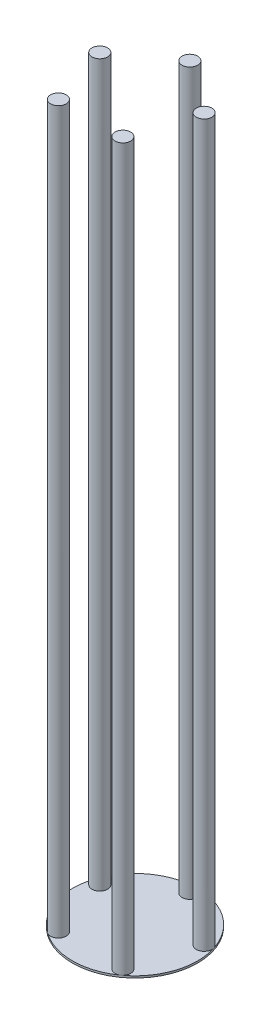
ISO-10303-21;
HEADER;
FILE_DESCRIPTION(('STEP AP214'),'2;1');
FILE_NAME('part.step','',(''),(''),'','','');
FILE_SCHEMA(('AUTOMOTIVE_DESIGN { 1 0 10303 214 1 1 1 1 }'));
ENDSEC;
DATA;
#1=APPLICATION_CONTEXT('core data for automotive mechanical design processes');
#2=APPLICATION_PROTOCOL_DEFINITION('international standard','automotive_design',2000,#1);
#3=PRODUCT_CONTEXT('',#1,'mechanical');
#4=PRODUCT('Part','Part','',(#3));
#5=PRODUCT_RELATED_PRODUCT_CATEGORY('part','',(#4));
#6=PRODUCT_DEFINITION_FORMATION('','',#4);
#7=PRODUCT_DEFINITION_CONTEXT('part definition',#1,'design');
#8=PRODUCT_DEFINITION('design','',#6,#7);
#9=PRODUCT_DEFINITION_SHAPE('','',#8);
#10=(LENGTH_UNIT() NAMED_UNIT(*) SI_UNIT(.MILLI.,.METRE.));
#11=(NAMED_UNIT(*) PLANE_ANGLE_UNIT() SI_UNIT($,.RADIAN.));
#12=(NAMED_UNIT(*) SI_UNIT($,.STERADIAN.) SOLID_ANGLE_UNIT());
#13=UNCERTAINTY_MEASURE_WITH_UNIT(LENGTH_MEASURE(1.E-05),#10,'distance_accuracy_value','');
#14=(GEOMETRIC_REPRESENTATION_CONTEXT(3) GLOBAL_UNCERTAINTY_ASSIGNED_CONTEXT((#13)) GLOBAL_UNIT_ASSIGNED_CONTEXT((#10,
#11,#12)) REPRESENTATION_CONTEXT('',''));
#15=CARTESIAN_POINT('',(0.,0.,0.));
#16=DIRECTION('',(0.,0.,1.));
#17=DIRECTION('',(1.,0.,0.));
#18=AXIS2_PLACEMENT_3D('',#15,#16,#17);
#19=CARTESIAN_POINT('',(0.,3.175,0.));
#20=DIRECTION('',(0.,-1.,0.));
#21=DIRECTION('',(0.,0.,-1.));
#22=AXIS2_PLACEMENT_3D('',#19,#20,#21);
#23=CYLINDRICAL_SURFACE('',#22,101.6);
#24=CARTESIAN_POINT('',(0.,3.175,0.));
#25=DIRECTION('',(0.,1.,0.));
#26=DIRECTION('',(0.,0.,1.));
#27=AXIS2_PLACEMENT_3D('',#24,#25,#26);
#28=CIRCLE('',#27,101.6);
#29=CARTESIAN_POINT('',(0.,3.175,-101.6));
#30=VERTEX_POINT('',#29);
#31=CARTESIAN_POINT('',(-96.6273420555882,3.17499999999992,-31.3961266284928));
#32=VERTEX_POINT('',#31);
#33=EDGE_CURVE('E11',#30,#32,#28,.T.);
#34=ORIENTED_EDGE('',*,*,#33,.F.);
#35=CARTESIAN_POINT('',(96.627342055587,3.17499999999992,-31.3961266284965));
#36=VERTEX_POINT('',#35);
#37=EDGE_CURVE('E42',#36,#30,#28,.T.);
#38=ORIENTED_EDGE('',*,*,#37,.F.);
#39=CARTESIAN_POINT('',(59.7189816329195,3.17499999999992,82.1961266284916));
#40=VERTEX_POINT('',#39);
#41=EDGE_CURVE('E73',#40,#36,#28,.T.);
#42=ORIENTED_EDGE('',*,*,#41,.F.);
#43=CARTESIAN_POINT('',(-59.7189816329111,3.17499999999992,82.1961266284977));
#44=VERTEX_POINT('',#43);
#45=EDGE_CURVE('E229',#44,#40,#28,.T.);
#46=ORIENTED_EDGE('',*,*,#45,.F.);
#47=EDGE_CURVE('E41',#32,#44,#28,.T.);
#48=ORIENTED_EDGE('',*,*,#47,.F.);
#49=EDGE_LOOP('',(#34,#38,#42,#46,#48));
#50=FACE_BOUND('',#49,.T.);
#51=CARTESIAN_POINT('',(0.,0.,0.));
#52=DIRECTION('',(0.,1.,0.));
#53=DIRECTION('',(0.,0.,1.));
#54=AXIS2_PLACEMENT_3D('',#51,#52,#53);
#55=CIRCLE('',#54,101.6);
#56=CARTESIAN_POINT('',(0.,0.,101.6));
#57=VERTEX_POINT('',#56);
#58=EDGE_CURVE('E36',#57,#57,#55,.T.);
#59=ORIENTED_EDGE('',*,*,#58,.T.);
#60=EDGE_LOOP('',(#59));
#61=FACE_BOUND('',#60,.T.);
#62=ADVANCED_FACE('F33',(#50,#61),#23,.T.);
#63=CARTESIAN_POINT('',(0.,3.175,0.));
#64=DIRECTION('',(0.,1.,0.));
#65=DIRECTION('',(0.,0.,1.));
#66=AXIS2_PLACEMENT_3D('',#63,#64,#65);
#67=PLANE('',#66);
#68=ORIENTED_EDGE('',*,*,#33,.T.);
#69=CARTESIAN_POINT('',(-84.5489242986374,3.175,-27.4716107999304));
#70=DIRECTION('',(0.,1.,0.));
#71=DIRECTION('',(0.,0.,1.));
#72=AXIS2_PLACEMENT_3D('',#69,#70,#71);
#73=CIRCLE('',#72,12.7000000000033);
#74=EDGE_CURVE('E47',#32,#32,#73,.T.);
#75=ORIENTED_EDGE('',*,*,#74,.F.);
#76=ORIENTED_EDGE('',*,*,#47,.T.);
#77=CARTESIAN_POINT('',(-52.2541089287963,3.175,71.9216107999343));
#78=DIRECTION('',(0.,1.,0.));
#79=DIRECTION('',(0.,0.,1.));
#80=AXIS2_PLACEMENT_3D('',#77,#78,#79);
#81=CIRCLE('',#80,12.7000000000055);
#82=EDGE_CURVE('E79',#44,#44,#81,.T.);
#83=ORIENTED_EDGE('',*,*,#82,.F.);
#84=ORIENTED_EDGE('',*,*,#45,.T.);
#85=CARTESIAN_POINT('',(52.2541089288054,3.175,71.9216107999313));
#86=DIRECTION('',(0.,1.,0.));
#87=DIRECTION('',(0.,0.,1.));
#88=AXIS2_PLACEMENT_3D('',#85,#86,#87);
#89=CIRCLE('',#88,12.7000000000044);
#90=EDGE_CURVE('E85',#40,#40,#89,.T.);
#91=ORIENTED_EDGE('',*,*,#90,.F.);
#92=ORIENTED_EDGE('',*,*,#41,.T.);
#93=CARTESIAN_POINT('',(84.5489242986409,3.175,-27.4716107999352));
#94=DIRECTION('',(0.,1.,0.));
#95=DIRECTION('',(0.,0.,1.));
#96=AXIS2_PLACEMENT_3D('',#93,#94,#95);
#97=CIRCLE('',#96,12.7000000000012);
#98=EDGE_CURVE('E70',#36,#36,#97,.T.);
#99=ORIENTED_EDGE('',*,*,#98,.F.);
#100=ORIENTED_EDGE('',*,*,#37,.T.);
#101=CARTESIAN_POINT('',(0.,3.175,-88.9));
#102=DIRECTION('',(0.,1.,0.));
#103=DIRECTION('',(0.,0.,1.));
#104=AXIS2_PLACEMENT_3D('',#101,#102,#103);
#105=CIRCLE('',#104,12.7);
#106=EDGE_CURVE('E68',#30,#30,#105,.T.);
#107=ORIENTED_EDGE('',*,*,#106,.F.);
#108=EDGE_LOOP('',(#68,#75,#76,#83,#84,#91,#92,#99,#100,#107));
#109=FACE_BOUND('',#108,.T.);
#110=ADVANCED_FACE('F66',(#109),#67,.T.);
#111=CARTESIAN_POINT('',(0.,0.,0.));
#112=DIRECTION('',(0.,1.,0.));
#113=DIRECTION('',(0.,0.,1.));
#114=AXIS2_PLACEMENT_3D('',#111,#112,#113);
#115=PLANE('',#114);
#116=ORIENTED_EDGE('',*,*,#58,.F.);
#117=EDGE_LOOP('',(#116));
#118=FACE_BOUND('',#117,.T.);
#119=ADVANCED_FACE('F103',(#118),#115,.F.);
#120=CARTESIAN_POINT('',(0.,1171.575,-88.9));
#121=DIRECTION('',(0.,-1.,0.));
#122=DIRECTION('',(0.,0.,-1.));
#123=AXIS2_PLACEMENT_3D('',#120,#121,#122);
#124=CYLINDRICAL_SURFACE('',#123,12.7);
#125=CARTESIAN_POINT('',(0.,1171.575,-88.9));
#126=DIRECTION('',(0.,1.,0.));
#127=DIRECTION('',(0.,0.,1.));
#128=AXIS2_PLACEMENT_3D('',#125,#126,#127);
#129=CIRCLE('',#128,12.7);
#130=CARTESIAN_POINT('',(0.,1171.575,-76.2));
#131=VERTEX_POINT('',#130);
#132=EDGE_CURVE('E96',#131,#131,#129,.T.);
#133=ORIENTED_EDGE('',*,*,#132,.F.);
#134=EDGE_LOOP('',(#133));
#135=FACE_BOUND('',#134,.T.);
#136=ORIENTED_EDGE('',*,*,#106,.T.);
#137=EDGE_LOOP('',(#136));
#138=FACE_BOUND('',#137,.T.);
#139=ADVANCED_FACE('F100',(#135,#138),#124,.T.);
#140=CARTESIAN_POINT('',(0.,1171.575,-88.9));
#141=DIRECTION('',(0.,1.,0.));
#142=DIRECTION('',(0.,0.,1.));
#143=AXIS2_PLACEMENT_3D('',#140,#141,#142);
#144=PLANE('',#143);
#145=ORIENTED_EDGE('',*,*,#132,.T.);
#146=EDGE_LOOP('',(#145));
#147=FACE_BOUND('',#146,.T.);
#148=ADVANCED_FACE('F102',(#147),#144,.T.);
#149=CARTESIAN_POINT('',(84.5489242986409,1171.575,-27.4716107999352));
#150=DIRECTION('',(0.,-1.,0.));
#151=DIRECTION('',(0.,0.,-1.));
#152=AXIS2_PLACEMENT_3D('',#149,#150,#151);
#153=CYLINDRICAL_SURFACE('',#152,12.7000000000012);
#154=CARTESIAN_POINT('',(84.5489242986409,1171.575,-27.4716107999352));
#155=DIRECTION('',(0.,1.,0.));
#156=DIRECTION('',(0.,0.,1.));
#157=AXIS2_PLACEMENT_3D('',#154,#155,#156);
#158=CIRCLE('',#157,12.7000000000012);
#159=CARTESIAN_POINT('',(84.5489242986409,1171.575,-14.771610799934));
#160=VERTEX_POINT('',#159);
#161=EDGE_CURVE('E92',#160,#160,#158,.T.);
#162=ORIENTED_EDGE('',*,*,#161,.F.);
#163=EDGE_LOOP('',(#162));
#164=FACE_BOUND('',#163,.T.);
#165=ORIENTED_EDGE('',*,*,#98,.T.);
#166=EDGE_LOOP('',(#165));
#167=FACE_BOUND('',#166,.T.);
#168=ADVANCED_FACE('F110',(#164,#167),#153,.T.);
#169=CARTESIAN_POINT('',(84.5489242986409,1171.575,-27.4716107999352));
#170=DIRECTION('',(0.,1.,0.));
#171=DIRECTION('',(0.,0.,1.));
#172=AXIS2_PLACEMENT_3D('',#169,#170,#171);
#173=PLANE('',#172);
#174=ORIENTED_EDGE('',*,*,#161,.T.);
#175=EDGE_LOOP('',(#174));
#176=FACE_BOUND('',#175,.T.);
#177=ADVANCED_FACE('F151',(#176),#173,.T.);
#178=CARTESIAN_POINT('',(52.2541089288054,1171.575,71.9216107999313));
#179=DIRECTION('',(0.,-1.,0.));
#180=DIRECTION('',(0.,0.,-1.));
#181=AXIS2_PLACEMENT_3D('',#178,#179,#180);
#182=CYLINDRICAL_SURFACE('',#181,12.7000000000044);
#183=CARTESIAN_POINT('',(52.2541089288054,1171.575,71.9216107999313));
#184=DIRECTION('',(0.,1.,0.));
#185=DIRECTION('',(0.,0.,1.));
#186=AXIS2_PLACEMENT_3D('',#183,#184,#185);
#187=CIRCLE('',#186,12.7000000000044);
#188=CARTESIAN_POINT('',(52.2541089288054,1171.575,84.6216107999357));
#189=VERTEX_POINT('',#188);
#190=EDGE_CURVE('E87',#189,#189,#187,.T.);
#191=ORIENTED_EDGE('',*,*,#190,.F.);
#192=EDGE_LOOP('',(#191));
#193=FACE_BOUND('',#192,.T.);
#194=ORIENTED_EDGE('',*,*,#90,.T.);
#195=EDGE_LOOP('',(#194));
#196=FACE_BOUND('',#195,.T.);
#197=ADVANCED_FACE('F160',(#193,#196),#182,.T.);
#198=CARTESIAN_POINT('',(52.2541089288054,1171.575,71.9216107999313));
#199=DIRECTION('',(0.,1.,0.));
#200=DIRECTION('',(0.,0.,1.));
#201=AXIS2_PLACEMENT_3D('',#198,#199,#200);
#202=PLANE('',#201);
#203=ORIENTED_EDGE('',*,*,#190,.T.);
#204=EDGE_LOOP('',(#203));
#205=FACE_BOUND('',#204,.T.);
#206=ADVANCED_FACE('F169',(#205),#202,.T.);
#207=CARTESIAN_POINT('',(-52.2541089287963,1171.575,71.9216107999343));
#208=DIRECTION('',(0.,-1.,0.));
#209=DIRECTION('',(0.,0.,-1.));
#210=AXIS2_PLACEMENT_3D('',#207,#208,#209);
#211=CYLINDRICAL_SURFACE('',#210,12.7000000000055);
#212=CARTESIAN_POINT('',(-52.2541089287963,1171.575,71.9216107999343));
#213=DIRECTION('',(0.,1.,0.));
#214=DIRECTION('',(0.,0.,1.));
#215=AXIS2_PLACEMENT_3D('',#212,#213,#214);
#216=CIRCLE('',#215,12.7000000000055);
#217=CARTESIAN_POINT('',(-52.2541089287963,1171.575,84.6216107999398));
#218=VERTEX_POINT('',#217);
#219=EDGE_CURVE('E82',#218,#218,#216,.T.);
#220=ORIENTED_EDGE('',*,*,#219,.F.);
#221=EDGE_LOOP('',(#220));
#222=FACE_BOUND('',#221,.T.);
#223=ORIENTED_EDGE('',*,*,#82,.T.);
#224=EDGE_LOOP('',(#223));
#225=FACE_BOUND('',#224,.T.);
#226=ADVANCED_FACE('F178',(#222,#225),#211,.T.);
#227=CARTESIAN_POINT('',(-52.2541089287963,1171.575,71.9216107999343));
#228=DIRECTION('',(0.,1.,0.));
#229=DIRECTION('',(0.,0.,1.));
#230=AXIS2_PLACEMENT_3D('',#227,#228,#229);
#231=PLANE('',#230);
#232=ORIENTED_EDGE('',*,*,#219,.T.);
#233=EDGE_LOOP('',(#232));
#234=FACE_BOUND('',#233,.T.);
#235=ADVANCED_FACE('F187',(#234),#231,.T.);
#236=CARTESIAN_POINT('',(-84.5489242986374,1171.575,-27.4716107999304));
#237=DIRECTION('',(0.,-1.,0.));
#238=DIRECTION('',(0.,0.,-1.));
#239=AXIS2_PLACEMENT_3D('',#236,#237,#238);
#240=CYLINDRICAL_SURFACE('',#239,12.7000000000033);
#241=CARTESIAN_POINT('',(-84.5489242986374,1171.575,-27.4716107999304));
#242=DIRECTION('',(0.,1.,0.));
#243=DIRECTION('',(0.,0.,1.));
#244=AXIS2_PLACEMENT_3D('',#241,#242,#243);
#245=CIRCLE('',#244,12.7000000000033);
#246=CARTESIAN_POINT('',(-84.5489242986374,1171.575,-14.7716107999271));
#247=VERTEX_POINT('',#246);
#248=EDGE_CURVE('E76',#247,#247,#245,.T.);
#249=ORIENTED_EDGE('',*,*,#248,.F.);
#250=EDGE_LOOP('',(#249));
#251=FACE_BOUND('',#250,.T.);
#252=ORIENTED_EDGE('',*,*,#74,.T.);
#253=EDGE_LOOP('',(#252));
#254=FACE_BOUND('',#253,.T.);
#255=ADVANCED_FACE('F196',(#251,#254),#240,.T.);
#256=CARTESIAN_POINT('',(-84.5489242986374,1171.575,-27.4716107999304));
#257=DIRECTION('',(0.,1.,0.));
#258=DIRECTION('',(0.,0.,1.));
#259=AXIS2_PLACEMENT_3D('',#256,#257,#258);
#260=PLANE('',#259);
#261=ORIENTED_EDGE('',*,*,#248,.T.);
#262=EDGE_LOOP('',(#261));
#263=FACE_BOUND('',#262,.T.);
#264=ADVANCED_FACE('F205',(#263),#260,.T.);
#265=CLOSED_SHELL('',(#62,#110,#119,#139,#148,#168,#177,#197,#206,#226,#235,#255,#264));
#266=MANIFOLD_SOLID_BREP('B2',#265);
#267=ADVANCED_BREP_SHAPE_REPRESENTATION('',(#18,#266),#14);
#268=SHAPE_DEFINITION_REPRESENTATION(#9,#267);
ENDSEC;
END-ISO-10303-21;
